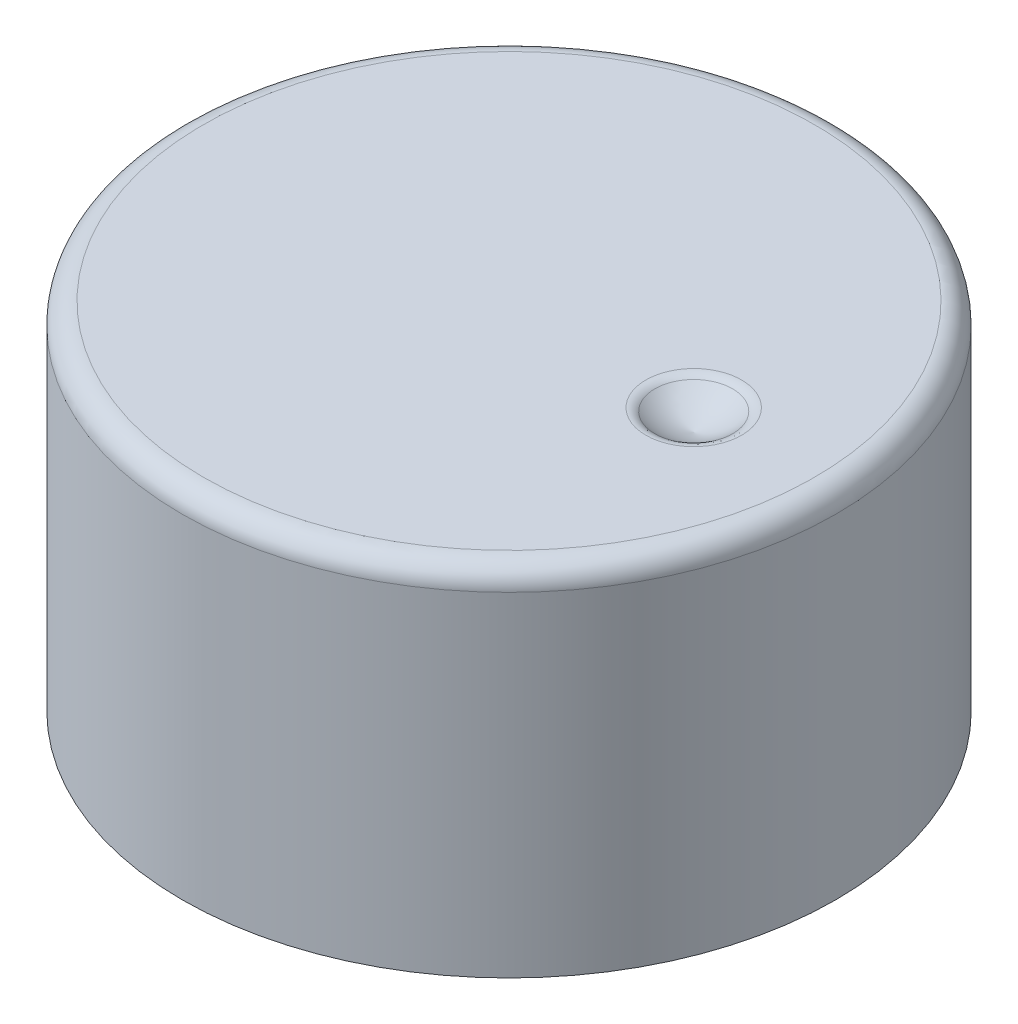
ISO-10303-21;
HEADER;
FILE_DESCRIPTION(('STEP AP214'),'2;1');
FILE_NAME('part.step','',(''),(''),'','','');
FILE_SCHEMA(('AUTOMOTIVE_DESIGN { 1 0 10303 214 1 1 1 1 }'));
ENDSEC;
DATA;
#1=APPLICATION_CONTEXT('core data for automotive mechanical design processes');
#2=APPLICATION_PROTOCOL_DEFINITION('international standard','automotive_design',2000,#1);
#3=PRODUCT_CONTEXT('',#1,'mechanical');
#4=PRODUCT('Part','Part','',(#3));
#5=PRODUCT_RELATED_PRODUCT_CATEGORY('part','',(#4));
#6=PRODUCT_DEFINITION_FORMATION('','',#4);
#7=PRODUCT_DEFINITION_CONTEXT('part definition',#1,'design');
#8=PRODUCT_DEFINITION('design','',#6,#7);
#9=PRODUCT_DEFINITION_SHAPE('','',#8);
#10=(LENGTH_UNIT() NAMED_UNIT(*) SI_UNIT(.MILLI.,.METRE.));
#11=(NAMED_UNIT(*) PLANE_ANGLE_UNIT() SI_UNIT($,.RADIAN.));
#12=(NAMED_UNIT(*) SI_UNIT($,.STERADIAN.) SOLID_ANGLE_UNIT());
#13=UNCERTAINTY_MEASURE_WITH_UNIT(LENGTH_MEASURE(1.E-05),#10,'distance_accuracy_value','');
#14=(GEOMETRIC_REPRESENTATION_CONTEXT(3) GLOBAL_UNCERTAINTY_ASSIGNED_CONTEXT((#13)) GLOBAL_UNIT_ASSIGNED_CONTEXT((#10,
#11,#12)) REPRESENTATION_CONTEXT('',''));
#15=CARTESIAN_POINT('',(0.,0.,0.));
#16=DIRECTION('',(0.,0.,1.));
#17=DIRECTION('',(1.,0.,0.));
#18=AXIS2_PLACEMENT_3D('',#15,#16,#17);
#19=CARTESIAN_POINT('',(0.,0.,0.));
#20=DIRECTION('',(0.,1.,0.));
#21=DIRECTION('',(0.,0.,1.));
#22=AXIS2_PLACEMENT_3D('',#19,#20,#21);
#23=PLANE('',#22);
#24=CARTESIAN_POINT('',(0.,0.,0.));
#25=DIRECTION('',(0.,1.,0.));
#26=DIRECTION('',(0.,0.,1.));
#27=AXIS2_PLACEMENT_3D('',#24,#25,#26);
#28=CIRCLE('',#27,20.);
#29=CARTESIAN_POINT('',(0.,0.,20.));
#30=VERTEX_POINT('',#29);
#31=EDGE_CURVE('E115',#30,#30,#28,.T.);
#32=ORIENTED_EDGE('',*,*,#31,.T.);
#33=EDGE_LOOP('',(#32));
#34=FACE_BOUND('',#33,.T.);
#35=CARTESIAN_POINT('',(0.,0.,0.));
#36=DIRECTION('',(0.,1.,0.));
#37=DIRECTION('',(0.,0.,1.));
#38=AXIS2_PLACEMENT_3D('',#35,#36,#37);
#39=CIRCLE('',#38,23.);
#40=CARTESIAN_POINT('',(0.,0.,23.));
#41=VERTEX_POINT('',#40);
#42=EDGE_CURVE('E124',#41,#41,#39,.T.);
#43=ORIENTED_EDGE('',*,*,#42,.F.);
#44=EDGE_LOOP('',(#43));
#45=FACE_BOUND('',#44,.T.);
#46=ADVANCED_FACE('F33',(#34,#45),#23,.F.);
#47=CARTESIAN_POINT('',(0.,25.,0.));
#48=DIRECTION('',(0.,-1.,0.));
#49=DIRECTION('',(0.,0.,-1.));
#50=AXIS2_PLACEMENT_3D('',#47,#48,#49);
#51=CYLINDRICAL_SURFACE('',#50,23.);
#52=CARTESIAN_POINT('',(0.,23.5,0.));
#53=DIRECTION('',(0.,1.,0.));
#54=DIRECTION('',(0.,0.,1.));
#55=AXIS2_PLACEMENT_3D('',#52,#53,#54);
#56=CIRCLE('',#55,23.);
#57=CARTESIAN_POINT('',(0.,23.5,23.));
#58=VERTEX_POINT('',#57);
#59=EDGE_CURVE('E130',#58,#58,#56,.F.);
#60=ORIENTED_EDGE('',*,*,#59,.T.);
#61=EDGE_LOOP('',(#60));
#62=FACE_BOUND('',#61,.T.);
#63=ORIENTED_EDGE('',*,*,#42,.T.);
#64=EDGE_LOOP('',(#63));
#65=FACE_BOUND('',#64,.T.);
#66=ADVANCED_FACE('F90',(#62,#65),#51,.T.);
#67=CARTESIAN_POINT('',(0.,25.,0.));
#68=DIRECTION('',(0.,1.,0.));
#69=DIRECTION('',(0.,0.,1.));
#70=AXIS2_PLACEMENT_3D('',#67,#68,#69);
#71=PLANE('',#70);
#72=CARTESIAN_POINT('',(13.,25.,0.));
#73=DIRECTION('',(0.,1.,0.));
#74=DIRECTION('',(0.,0.,1.));
#75=AXIS2_PLACEMENT_3D('',#72,#73,#74);
#76=CIRCLE('',#75,3.37034694046933);
#77=CARTESIAN_POINT('',(13.,25.,3.37034694046933));
#78=VERTEX_POINT('',#77);
#79=EDGE_CURVE('E11',#78,#78,#76,.F.);
#80=ORIENTED_EDGE('',*,*,#79,.T.);
#81=EDGE_LOOP('',(#80));
#82=FACE_BOUND('',#81,.T.);
#83=CARTESIAN_POINT('',(0.,25.,0.));
#84=DIRECTION('',(0.,1.,0.));
#85=DIRECTION('',(0.,0.,1.));
#86=AXIS2_PLACEMENT_3D('',#83,#84,#85);
#87=CIRCLE('',#86,21.5);
#88=CARTESIAN_POINT('',(0.,25.,21.5));
#89=VERTEX_POINT('',#88);
#90=EDGE_CURVE('E122',#89,#89,#87,.T.);
#91=ORIENTED_EDGE('',*,*,#90,.T.);
#92=EDGE_LOOP('',(#91));
#93=FACE_BOUND('',#92,.T.);
#94=ADVANCED_FACE('F96',(#82,#93),#71,.T.);
#95=CARTESIAN_POINT('',(0.,12.,0.));
#96=DIRECTION('',(0.,-1.,0.));
#97=DIRECTION('',(0.,0.,-1.));
#98=AXIS2_PLACEMENT_3D('',#95,#96,#97);
#99=PLANE('',#98);
#100=CARTESIAN_POINT('',(0.,12.,0.));
#101=DIRECTION('',(0.,-1.,0.));
#102=DIRECTION('',(0.,0.,-1.));
#103=AXIS2_PLACEMENT_3D('',#100,#101,#102);
#104=CIRCLE('',#103,3.1);
#105=CARTESIAN_POINT('',(0.45,12.,3.067164814613));
#106=VERTEX_POINT('',#105);
#107=CARTESIAN_POINT('',(0.45,12.,-3.067164814613));
#108=VERTEX_POINT('',#107);
#109=EDGE_CURVE('E201',#106,#108,#104,.F.);
#110=ORIENTED_EDGE('',*,*,#109,.T.);
#111=DIRECTION('',(0.,0.,-1.));
#112=VECTOR('',#111,1.);
#113=CARTESIAN_POINT('',(0.45,12.,0.));
#114=LINE('',#113,#112);
#115=EDGE_CURVE('E47',#106,#108,#114,.T.);
#116=ORIENTED_EDGE('',*,*,#115,.F.);
#117=EDGE_LOOP('',(#110,#116));
#118=FACE_BOUND('',#117,.T.);
#119=CARTESIAN_POINT('',(0.,12.,0.));
#120=DIRECTION('',(0.,-1.,0.));
#121=DIRECTION('',(0.,0.,-1.));
#122=AXIS2_PLACEMENT_3D('',#119,#120,#121);
#123=CIRCLE('',#122,10.);
#124=CARTESIAN_POINT('',(0.,12.,-10.));
#125=VERTEX_POINT('',#124);
#126=EDGE_CURVE('E204',#125,#125,#123,.T.);
#127=ORIENTED_EDGE('',*,*,#126,.T.);
#128=EDGE_LOOP('',(#127));
#129=FACE_BOUND('',#128,.T.);
#130=DIRECTION('',(0.,0.,-1.));
#131=VECTOR('',#130,1.);
#132=CARTESIAN_POINT('',(-0.45,12.,0.));
#133=LINE('',#132,#131);
#134=CARTESIAN_POINT('',(-0.45,12.,3.067164814613));
#135=VERTEX_POINT('',#134);
#136=CARTESIAN_POINT('',(-0.45,12.,-3.067164814613));
#137=VERTEX_POINT('',#136);
#138=EDGE_CURVE('E54',#135,#137,#133,.T.);
#139=ORIENTED_EDGE('',*,*,#138,.T.);
#140=CARTESIAN_POINT('',(0.,12.,0.));
#141=DIRECTION('',(0.,-1.,0.));
#142=DIRECTION('',(0.,0.,-1.));
#143=AXIS2_PLACEMENT_3D('',#140,#141,#142);
#144=CIRCLE('',#143,3.1);
#145=EDGE_CURVE('E120',#137,#135,#144,.F.);
#146=ORIENTED_EDGE('',*,*,#145,.T.);
#147=EDGE_LOOP('',(#139,#146));
#148=FACE_BOUND('',#147,.T.);
#149=ADVANCED_FACE('F140',(#118,#129,#148),#99,.T.);
#150=CARTESIAN_POINT('',(0.,12.,0.));
#151=DIRECTION('',(0.,-1.,0.));
#152=DIRECTION('',(0.,0.,-1.));
#153=AXIS2_PLACEMENT_3D('',#150,#151,#152);
#154=CYLINDRICAL_SURFACE('',#153,10.);
#155=CARTESIAN_POINT('',(0.,11.9175359259421,0.));
#156=DIRECTION('',(0.,1.,0.));
#157=DIRECTION('',(0.,0.,1.));
#158=AXIS2_PLACEMENT_3D('',#155,#156,#157);
#159=CIRCLE('',#158,10.);
#160=CARTESIAN_POINT('',(0.,11.9175359259421,10.));
#161=VERTEX_POINT('',#160);
#162=EDGE_CURVE('E118',#161,#161,#159,.F.);
#163=ORIENTED_EDGE('',*,*,#162,.T.);
#164=EDGE_LOOP('',(#163));
#165=FACE_BOUND('',#164,.T.);
#166=ORIENTED_EDGE('',*,*,#126,.F.);
#167=EDGE_LOOP('',(#166));
#168=FACE_BOUND('',#167,.T.);
#169=ADVANCED_FACE('F145',(#165,#168),#154,.F.);
#170=CARTESIAN_POINT('',(0.,23.,0.));
#171=DIRECTION('',(0.,-1.,0.));
#172=DIRECTION('',(0.,0.,-1.));
#173=AXIS2_PLACEMENT_3D('',#170,#171,#172);
#174=PLANE('',#173);
#175=DIRECTION('',(0.,0.,1.));
#176=VECTOR('',#175,1.);
#177=CARTESIAN_POINT('',(0.45,23.,0.));
#178=LINE('',#177,#176);
#179=CARTESIAN_POINT('',(0.45,23.,-3.067164814613));
#180=VERTEX_POINT('',#179);
#181=CARTESIAN_POINT('',(0.45,23.,3.067164814613));
#182=VERTEX_POINT('',#181);
#183=EDGE_CURVE('E177',#180,#182,#178,.T.);
#184=ORIENTED_EDGE('',*,*,#183,.F.);
#185=CARTESIAN_POINT('',(0.,23.,0.));
#186=DIRECTION('',(0.,-1.,0.));
#187=DIRECTION('',(0.,0.,-1.));
#188=AXIS2_PLACEMENT_3D('',#185,#186,#187);
#189=CIRCLE('',#188,3.1);
#190=EDGE_CURVE('E183',#180,#182,#189,.T.);
#191=ORIENTED_EDGE('',*,*,#190,.T.);
#192=EDGE_LOOP('',(#184,#191));
#193=FACE_BOUND('',#192,.T.);
#194=ADVANCED_FACE('F150',(#193),#174,.T.);
#195=CARTESIAN_POINT('',(0.,23.,0.));
#196=DIRECTION('',(0.,-1.,0.));
#197=DIRECTION('',(0.,0.,-1.));
#198=AXIS2_PLACEMENT_3D('',#195,#196,#197);
#199=CYLINDRICAL_SURFACE('',#198,3.1);
#200=ORIENTED_EDGE('',*,*,#109,.F.);
#201=DIRECTION('',(0.,-1.,0.));
#202=VECTOR('',#201,1.);
#203=CARTESIAN_POINT('',(0.45,23.,3.067164814613));
#204=LINE('',#203,#202);
#205=EDGE_CURVE('E174',#182,#106,#204,.T.);
#206=ORIENTED_EDGE('',*,*,#205,.F.);
#207=ORIENTED_EDGE('',*,*,#190,.F.);
#208=DIRECTION('',(0.,-1.,0.));
#209=VECTOR('',#208,1.);
#210=CARTESIAN_POINT('',(0.45,23.,-3.067164814613));
#211=LINE('',#210,#209);
#212=EDGE_CURVE('E180',#180,#108,#211,.T.);
#213=ORIENTED_EDGE('',*,*,#212,.T.);
#214=EDGE_LOOP('',(#200,#206,#207,#213));
#215=FACE_BOUND('',#214,.T.);
#216=ADVANCED_FACE('F164',(#215),#199,.F.);
#217=CARTESIAN_POINT('',(0.45,23.,0.));
#218=DIRECTION('',(1.,0.,0.));
#219=DIRECTION('',(0.,0.,-1.));
#220=AXIS2_PLACEMENT_3D('',#217,#218,#219);
#221=PLANE('',#220);
#222=ORIENTED_EDGE('',*,*,#205,.T.);
#223=ORIENTED_EDGE('',*,*,#115,.T.);
#224=ORIENTED_EDGE('',*,*,#212,.F.);
#225=ORIENTED_EDGE('',*,*,#183,.T.);
#226=EDGE_LOOP('',(#222,#223,#224,#225));
#227=FACE_BOUND('',#226,.T.);
#228=ADVANCED_FACE('F157',(#227),#221,.T.);
#229=CARTESIAN_POINT('',(0.,23.,0.));
#230=DIRECTION('',(0.,-1.,0.));
#231=DIRECTION('',(0.,0.,-1.));
#232=AXIS2_PLACEMENT_3D('',#229,#230,#231);
#233=PLANE('',#232);
#234=DIRECTION('',(0.,0.,1.));
#235=VECTOR('',#234,1.);
#236=CARTESIAN_POINT('',(-0.45,23.,0.));
#237=LINE('',#236,#235);
#238=CARTESIAN_POINT('',(-0.45,23.,-3.067164814613));
#239=VERTEX_POINT('',#238);
#240=CARTESIAN_POINT('',(-0.45,23.,3.067164814613));
#241=VERTEX_POINT('',#240);
#242=EDGE_CURVE('E197',#239,#241,#237,.T.);
#243=ORIENTED_EDGE('',*,*,#242,.T.);
#244=CARTESIAN_POINT('',(0.,23.,0.));
#245=DIRECTION('',(0.,-1.,0.));
#246=DIRECTION('',(0.,0.,-1.));
#247=AXIS2_PLACEMENT_3D('',#244,#245,#246);
#248=CIRCLE('',#247,3.1);
#249=EDGE_CURVE('E192',#241,#239,#248,.T.);
#250=ORIENTED_EDGE('',*,*,#249,.T.);
#251=EDGE_LOOP('',(#243,#250));
#252=FACE_BOUND('',#251,.T.);
#253=ADVANCED_FACE('F154',(#252),#233,.T.);
#254=CARTESIAN_POINT('',(0.,23.,0.));
#255=DIRECTION('',(0.,-1.,0.));
#256=DIRECTION('',(0.,0.,-1.));
#257=AXIS2_PLACEMENT_3D('',#254,#255,#256);
#258=CYLINDRICAL_SURFACE('',#257,3.1);
#259=ORIENTED_EDGE('',*,*,#145,.F.);
#260=DIRECTION('',(0.,-1.,0.));
#261=VECTOR('',#260,1.);
#262=CARTESIAN_POINT('',(-0.45,23.,-3.067164814613));
#263=LINE('',#262,#261);
#264=EDGE_CURVE('E188',#239,#137,#263,.T.);
#265=ORIENTED_EDGE('',*,*,#264,.F.);
#266=ORIENTED_EDGE('',*,*,#249,.F.);
#267=DIRECTION('',(0.,-1.,0.));
#268=VECTOR('',#267,1.);
#269=CARTESIAN_POINT('',(-0.45,23.,3.067164814613));
#270=LINE('',#269,#268);
#271=EDGE_CURVE('E189',#241,#135,#270,.T.);
#272=ORIENTED_EDGE('',*,*,#271,.T.);
#273=EDGE_LOOP('',(#259,#265,#266,#272));
#274=FACE_BOUND('',#273,.T.);
#275=ADVANCED_FACE('F110',(#274),#258,.F.);
#276=CARTESIAN_POINT('',(-0.45,23.,0.));
#277=DIRECTION('',(1.,0.,0.));
#278=DIRECTION('',(0.,0.,-1.));
#279=AXIS2_PLACEMENT_3D('',#276,#277,#278);
#280=PLANE('',#279);
#281=ORIENTED_EDGE('',*,*,#138,.F.);
#282=ORIENTED_EDGE('',*,*,#271,.F.);
#283=ORIENTED_EDGE('',*,*,#242,.F.);
#284=ORIENTED_EDGE('',*,*,#264,.T.);
#285=EDGE_LOOP('',(#281,#282,#283,#284));
#286=FACE_BOUND('',#285,.T.);
#287=ADVANCED_FACE('F105',(#286),#280,.F.);
#288=CARTESIAN_POINT('',(0.,11.9175359259421,0.));
#289=DIRECTION('',(0.,-1.,0.));
#290=DIRECTION('',(0.,0.,-1.));
#291=AXIS2_PLACEMENT_3D('',#288,#289,#290);
#292=CONICAL_SURFACE('',#291,10.,0.698131700797733);
#293=ORIENTED_EDGE('',*,*,#31,.F.);
#294=EDGE_LOOP('',(#293));
#295=FACE_BOUND('',#294,.T.);
#296=ORIENTED_EDGE('',*,*,#162,.F.);
#297=EDGE_LOOP('',(#296));
#298=FACE_BOUND('',#297,.T.);
#299=ADVANCED_FACE('F85',(#295,#298),#292,.F.);
#300=CARTESIAN_POINT('',(0.,23.5,0.));
#301=DIRECTION('',(0.,1.,0.));
#302=DIRECTION('',(0.,0.,1.));
#303=AXIS2_PLACEMENT_3D('',#300,#301,#302);
#304=TOROIDAL_SURFACE('',#303,21.5,1.5);
#305=ORIENTED_EDGE('',*,*,#59,.F.);
#306=EDGE_LOOP('',(#305));
#307=FACE_BOUND('',#306,.T.);
#308=ORIENTED_EDGE('',*,*,#90,.F.);
#309=EDGE_LOOP('',(#308));
#310=FACE_BOUND('',#309,.T.);
#311=ADVANCED_FACE('F77',(#307,#310),#304,.T.);
#312=CARTESIAN_POINT('',(13.,29.5757273055535,-1.16286365277673));
#313=DIRECTION('',(-1.,0.,0.));
#314=DIRECTION('',(0.,0.,1.));
#315=AXIS2_PLACEMENT_3D('',#312,#313,#314);
#316=CIRCLE('',#315,6.18600955110782);
#317=TRIMMED_CURVE('',#316,(PARAMETER_VALUE(-1.38168835806334)),
(PARAMETER_VALUE(1.38168835806334)),.T.,.PARAMETER.);
#318=CARTESIAN_POINT('',(13.,29.5757273055535,0.));
#319=DIRECTION('',(0.,1.,0.));
#320=AXIS1_PLACEMENT('',#318,#319);
#321=SURFACE_OF_REVOLUTION('',#317,#320);
#322=CARTESIAN_POINT('',(13.,24.7759142631106,0.));
#323=DIRECTION('',(0.,1.,0.));
#324=DIRECTION('',(0.,0.,1.));
#325=AXIS2_PLACEMENT_3D('',#322,#323,#324);
#326=CIRCLE('',#325,2.73950856473308);
#327=CARTESIAN_POINT('',(13.,24.7759142631106,2.73950856473308));
#328=VERTEX_POINT('',#327);
#329=EDGE_CURVE('E41',#328,#328,#326,.T.);
#330=ORIENTED_EDGE('',*,*,#329,.T.);
#331=EDGE_LOOP('',(#330));
#332=FACE_BOUND('',#331,.T.);
#333=CARTESIAN_POINT('',(13.,23.5,0.));
#334=VERTEX_POINT('',#333);
#335=VERTEX_LOOP('',#334);
#336=FACE_BOUND('',#335,.T.);
#337=ADVANCED_FACE('F75',(#332,#336),#321,.F.);
#338=CARTESIAN_POINT('',(13.,24.,0.));
#339=DIRECTION('',(0.,1.,0.));
#340=DIRECTION('',(0.,0.,1.));
#341=AXIS2_PLACEMENT_3D('',#338,#339,#340);
#342=TOROIDAL_SURFACE('',#341,3.37034694046933,1.);
#343=ORIENTED_EDGE('',*,*,#79,.F.);
#344=EDGE_LOOP('',(#343));
#345=FACE_BOUND('',#344,.T.);
#346=ORIENTED_EDGE('',*,*,#329,.F.);
#347=EDGE_LOOP('',(#346));
#348=FACE_BOUND('',#347,.T.);
#349=ADVANCED_FACE('F35',(#345,#348),#342,.T.);
#350=CLOSED_SHELL('',(#46,#66,#94,#149,#169,#194,#216,#228,#253,#275,#287,#299,#311,#337,#349));
#351=MANIFOLD_SOLID_BREP('B2',#350);
#352=ADVANCED_BREP_SHAPE_REPRESENTATION('',(#18,#351),#14);
#353=SHAPE_DEFINITION_REPRESENTATION(#9,#352);
ENDSEC;
END-ISO-10303-21;
